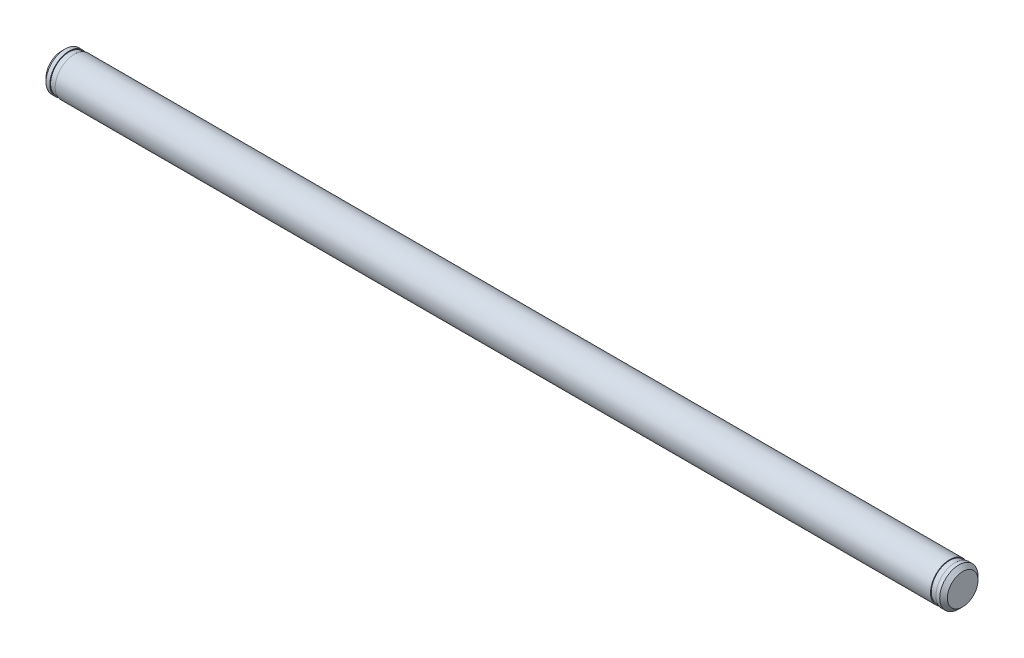
ISO-10303-21;
HEADER;
FILE_DESCRIPTION(('STEP AP214'),'2;1');
FILE_NAME('part.step','',(''),(''),'','','');
FILE_SCHEMA(('AUTOMOTIVE_DESIGN { 1 0 10303 214 1 1 1 1 }'));
ENDSEC;
DATA;
#1=APPLICATION_CONTEXT('core data for automotive mechanical design processes');
#2=APPLICATION_PROTOCOL_DEFINITION('international standard','automotive_design',2000,#1);
#3=PRODUCT_CONTEXT('',#1,'mechanical');
#4=PRODUCT('Part','Part','',(#3));
#5=PRODUCT_RELATED_PRODUCT_CATEGORY('part','',(#4));
#6=PRODUCT_DEFINITION_FORMATION('','',#4);
#7=PRODUCT_DEFINITION_CONTEXT('part definition',#1,'design');
#8=PRODUCT_DEFINITION('design','',#6,#7);
#9=PRODUCT_DEFINITION_SHAPE('','',#8);
#10=(LENGTH_UNIT() NAMED_UNIT(*) SI_UNIT(.MILLI.,.METRE.));
#11=(NAMED_UNIT(*) PLANE_ANGLE_UNIT() SI_UNIT($,.RADIAN.));
#12=(NAMED_UNIT(*) SI_UNIT($,.STERADIAN.) SOLID_ANGLE_UNIT());
#13=UNCERTAINTY_MEASURE_WITH_UNIT(LENGTH_MEASURE(1.E-05),#10,'distance_accuracy_value','');
#14=(GEOMETRIC_REPRESENTATION_CONTEXT(3) GLOBAL_UNCERTAINTY_ASSIGNED_CONTEXT((#13)) GLOBAL_UNIT_ASSIGNED_CONTEXT((#10,
#11,#12)) REPRESENTATION_CONTEXT('',''));
#15=CARTESIAN_POINT('',(0.,0.,0.));
#16=DIRECTION('',(0.,0.,1.));
#17=DIRECTION('',(1.,0.,0.));
#18=AXIS2_PLACEMENT_3D('',#15,#16,#17);
#19=CARTESIAN_POINT('',(-58.85,0.,0.));
#20=DIRECTION('',(-1.,0.,0.));
#21=DIRECTION('',(0.,-1.,0.));
#22=AXIS2_PLACEMENT_3D('',#19,#20,#21);
#23=PLANE('',#22);
#24=CARTESIAN_POINT('',(-58.85,0.,0.));
#25=DIRECTION('',(-1.,0.,0.));
#26=DIRECTION('',(0.,-1.,0.));
#27=AXIS2_PLACEMENT_3D('',#24,#25,#26);
#28=CIRCLE('',#27,2.);
#29=CARTESIAN_POINT('',(-58.85,-2.00000000000001,0.));
#30=VERTEX_POINT('',#29);
#31=EDGE_CURVE('E10',#30,#30,#28,.T.);
#32=ORIENTED_EDGE('',*,*,#31,.T.);
#33=EDGE_LOOP('',(#32));
#34=FACE_BOUND('',#33,.T.);
#35=ADVANCED_FACE('F34',(#34),#23,.T.);
#36=CARTESIAN_POINT('',(58.85,0.,0.));
#37=DIRECTION('',(1.,0.,0.));
#38=DIRECTION('',(0.,1.,0.));
#39=AXIS2_PLACEMENT_3D('',#36,#37,#38);
#40=CYLINDRICAL_SURFACE('',#39,2.5);
#41=CARTESIAN_POINT('',(-58.35,0.,0.));
#42=DIRECTION('',(-1.,0.,0.));
#43=DIRECTION('',(0.,-1.,0.));
#44=AXIS2_PLACEMENT_3D('',#41,#42,#43);
#45=CIRCLE('',#44,2.5);
#46=CARTESIAN_POINT('',(-58.35,-2.50000000000001,0.));
#47=VERTEX_POINT('',#46);
#48=EDGE_CURVE('E42',#47,#47,#45,.F.);
#49=ORIENTED_EDGE('',*,*,#48,.T.);
#50=EDGE_LOOP('',(#49));
#51=FACE_BOUND('',#50,.T.);
#52=CARTESIAN_POINT('',(-57.85,0.,0.));
#53=DIRECTION('',(1.,0.,0.));
#54=DIRECTION('',(0.,1.,0.));
#55=AXIS2_PLACEMENT_3D('',#52,#53,#54);
#56=CIRCLE('',#55,2.5);
#57=CARTESIAN_POINT('',(-57.85,2.49999999999999,0.));
#58=VERTEX_POINT('',#57);
#59=EDGE_CURVE('E55',#58,#58,#56,.T.);
#60=ORIENTED_EDGE('',*,*,#59,.F.);
#61=EDGE_LOOP('',(#60));
#62=FACE_BOUND('',#61,.T.);
#63=ADVANCED_FACE('F98',(#51,#62),#40,.T.);
#64=CARTESIAN_POINT('',(-57.85,2.49999999999999,0.));
#65=DIRECTION('',(1.,0.,0.));
#66=DIRECTION('',(0.,1.,0.));
#67=AXIS2_PLACEMENT_3D('',#64,#65,#66);
#68=PLANE('',#67);
#69=ORIENTED_EDGE('',*,*,#59,.T.);
#70=EDGE_LOOP('',(#69));
#71=FACE_BOUND('',#70,.T.);
#72=CARTESIAN_POINT('',(-57.85,0.,0.));
#73=DIRECTION('',(1.,0.,0.));
#74=DIRECTION('',(0.,1.,0.));
#75=AXIS2_PLACEMENT_3D('',#72,#73,#74);
#76=CIRCLE('',#75,2.4);
#77=CARTESIAN_POINT('',(-57.85,2.39999999999999,0.));
#78=VERTEX_POINT('',#77);
#79=EDGE_CURVE('E58',#78,#78,#76,.T.);
#80=ORIENTED_EDGE('',*,*,#79,.F.);
#81=EDGE_LOOP('',(#80));
#82=FACE_BOUND('',#81,.T.);
#83=ADVANCED_FACE('F103',(#71,#82),#68,.T.);
#84=CARTESIAN_POINT('',(58.85,0.,0.));
#85=DIRECTION('',(1.,0.,0.));
#86=DIRECTION('',(0.,1.,0.));
#87=AXIS2_PLACEMENT_3D('',#84,#85,#86);
#88=CYLINDRICAL_SURFACE('',#87,2.4);
#89=ORIENTED_EDGE('',*,*,#79,.T.);
#90=EDGE_LOOP('',(#89));
#91=FACE_BOUND('',#90,.T.);
#92=CARTESIAN_POINT('',(-57.15,0.,0.));
#93=DIRECTION('',(1.,0.,0.));
#94=DIRECTION('',(0.,1.,0.));
#95=AXIS2_PLACEMENT_3D('',#92,#93,#94);
#96=CIRCLE('',#95,2.4);
#97=CARTESIAN_POINT('',(-57.15,2.39999999999999,0.));
#98=VERTEX_POINT('',#97);
#99=EDGE_CURVE('E61',#98,#98,#96,.T.);
#100=ORIENTED_EDGE('',*,*,#99,.F.);
#101=EDGE_LOOP('',(#100));
#102=FACE_BOUND('',#101,.T.);
#103=ADVANCED_FACE('F179',(#91,#102),#88,.T.);
#104=CARTESIAN_POINT('',(-57.15,2.39999999999999,0.));
#105=DIRECTION('',(-1.,0.,0.));
#106=DIRECTION('',(0.,-1.,0.));
#107=AXIS2_PLACEMENT_3D('',#104,#105,#106);
#108=PLANE('',#107);
#109=ORIENTED_EDGE('',*,*,#99,.T.);
#110=EDGE_LOOP('',(#109));
#111=FACE_BOUND('',#110,.T.);
#112=CARTESIAN_POINT('',(-57.15,0.,0.));
#113=DIRECTION('',(1.,0.,0.));
#114=DIRECTION('',(0.,1.,0.));
#115=AXIS2_PLACEMENT_3D('',#112,#113,#114);
#116=CIRCLE('',#115,2.5);
#117=CARTESIAN_POINT('',(-57.15,2.49999999999999,0.));
#118=VERTEX_POINT('',#117);
#119=EDGE_CURVE('E64',#118,#118,#116,.T.);
#120=ORIENTED_EDGE('',*,*,#119,.F.);
#121=EDGE_LOOP('',(#120));
#122=FACE_BOUND('',#121,.T.);
#123=ADVANCED_FACE('F169',(#111,#122),#108,.T.);
#124=CARTESIAN_POINT('',(58.85,0.,0.));
#125=DIRECTION('',(1.,0.,0.));
#126=DIRECTION('',(0.,1.,0.));
#127=AXIS2_PLACEMENT_3D('',#124,#125,#126);
#128=CYLINDRICAL_SURFACE('',#127,2.5);
#129=ORIENTED_EDGE('',*,*,#119,.T.);
#130=EDGE_LOOP('',(#129));
#131=FACE_BOUND('',#130,.T.);
#132=CARTESIAN_POINT('',(57.15,0.,0.));
#133=DIRECTION('',(1.,0.,0.));
#134=DIRECTION('',(0.,1.,0.));
#135=AXIS2_PLACEMENT_3D('',#132,#133,#134);
#136=CIRCLE('',#135,2.5);
#137=CARTESIAN_POINT('',(57.15,2.5,0.));
#138=VERTEX_POINT('',#137);
#139=EDGE_CURVE('E67',#138,#138,#136,.T.);
#140=ORIENTED_EDGE('',*,*,#139,.F.);
#141=EDGE_LOOP('',(#140));
#142=FACE_BOUND('',#141,.T.);
#143=ADVANCED_FACE('F159',(#131,#142),#128,.T.);
#144=CARTESIAN_POINT('',(57.15,2.4,0.));
#145=DIRECTION('',(1.,0.,0.));
#146=DIRECTION('',(0.,1.,0.));
#147=AXIS2_PLACEMENT_3D('',#144,#145,#146);
#148=PLANE('',#147);
#149=ORIENTED_EDGE('',*,*,#139,.T.);
#150=EDGE_LOOP('',(#149));
#151=FACE_BOUND('',#150,.T.);
#152=CARTESIAN_POINT('',(57.15,0.,0.));
#153=DIRECTION('',(1.,0.,0.));
#154=DIRECTION('',(0.,1.,0.));
#155=AXIS2_PLACEMENT_3D('',#152,#153,#154);
#156=CIRCLE('',#155,2.4);
#157=CARTESIAN_POINT('',(57.15,2.4,0.));
#158=VERTEX_POINT('',#157);
#159=EDGE_CURVE('E70',#158,#158,#156,.T.);
#160=ORIENTED_EDGE('',*,*,#159,.F.);
#161=EDGE_LOOP('',(#160));
#162=FACE_BOUND('',#161,.T.);
#163=ADVANCED_FACE('F94',(#151,#162),#148,.T.);
#164=CARTESIAN_POINT('',(58.85,0.,0.));
#165=DIRECTION('',(1.,0.,0.));
#166=DIRECTION('',(0.,1.,0.));
#167=AXIS2_PLACEMENT_3D('',#164,#165,#166);
#168=CYLINDRICAL_SURFACE('',#167,2.4);
#169=ORIENTED_EDGE('',*,*,#159,.T.);
#170=EDGE_LOOP('',(#169));
#171=FACE_BOUND('',#170,.T.);
#172=CARTESIAN_POINT('',(57.85,0.,0.));
#173=DIRECTION('',(1.,0.,0.));
#174=DIRECTION('',(0.,1.,0.));
#175=AXIS2_PLACEMENT_3D('',#172,#173,#174);
#176=CIRCLE('',#175,2.4);
#177=CARTESIAN_POINT('',(57.85,2.4,0.));
#178=VERTEX_POINT('',#177);
#179=EDGE_CURVE('E73',#178,#178,#176,.T.);
#180=ORIENTED_EDGE('',*,*,#179,.F.);
#181=EDGE_LOOP('',(#180));
#182=FACE_BOUND('',#181,.T.);
#183=ADVANCED_FACE('F84',(#171,#182),#168,.T.);
#184=CARTESIAN_POINT('',(57.85,2.5,0.));
#185=DIRECTION('',(-1.,0.,0.));
#186=DIRECTION('',(0.,-1.,0.));
#187=AXIS2_PLACEMENT_3D('',#184,#185,#186);
#188=PLANE('',#187);
#189=ORIENTED_EDGE('',*,*,#179,.T.);
#190=EDGE_LOOP('',(#189));
#191=FACE_BOUND('',#190,.T.);
#192=CARTESIAN_POINT('',(57.85,0.,0.));
#193=DIRECTION('',(1.,0.,0.));
#194=DIRECTION('',(0.,1.,0.));
#195=AXIS2_PLACEMENT_3D('',#192,#193,#194);
#196=CIRCLE('',#195,2.5);
#197=CARTESIAN_POINT('',(57.85,2.5,0.));
#198=VERTEX_POINT('',#197);
#199=EDGE_CURVE('E76',#198,#198,#196,.T.);
#200=ORIENTED_EDGE('',*,*,#199,.F.);
#201=EDGE_LOOP('',(#200));
#202=FACE_BOUND('',#201,.T.);
#203=ADVANCED_FACE('F82',(#191,#202),#188,.T.);
#204=CARTESIAN_POINT('',(58.85,0.,0.));
#205=DIRECTION('',(1.,0.,0.));
#206=DIRECTION('',(0.,1.,0.));
#207=AXIS2_PLACEMENT_3D('',#204,#205,#206);
#208=CYLINDRICAL_SURFACE('',#207,2.5);
#209=CARTESIAN_POINT('',(58.35,0.,0.));
#210=DIRECTION('',(1.,0.,0.));
#211=DIRECTION('',(0.,1.,0.));
#212=AXIS2_PLACEMENT_3D('',#209,#210,#211);
#213=CIRCLE('',#212,2.5);
#214=CARTESIAN_POINT('',(58.35,2.5,0.));
#215=VERTEX_POINT('',#214);
#216=EDGE_CURVE('E46',#215,#215,#213,.F.);
#217=ORIENTED_EDGE('',*,*,#216,.T.);
#218=EDGE_LOOP('',(#217));
#219=FACE_BOUND('',#218,.T.);
#220=ORIENTED_EDGE('',*,*,#199,.T.);
#221=EDGE_LOOP('',(#220));
#222=FACE_BOUND('',#221,.T.);
#223=ADVANCED_FACE('F80',(#219,#222),#208,.T.);
#224=CARTESIAN_POINT('',(58.85,0.,0.));
#225=DIRECTION('',(1.,0.,0.));
#226=DIRECTION('',(0.,1.,0.));
#227=AXIS2_PLACEMENT_3D('',#224,#225,#226);
#228=PLANE('',#227);
#229=CARTESIAN_POINT('',(58.85,0.,0.));
#230=DIRECTION('',(1.,0.,0.));
#231=DIRECTION('',(0.,1.,0.));
#232=AXIS2_PLACEMENT_3D('',#229,#230,#231);
#233=CIRCLE('',#232,2.00000000000003);
#234=CARTESIAN_POINT('',(58.85,2.00000000000004,0.));
#235=VERTEX_POINT('',#234);
#236=EDGE_CURVE('E50',#235,#235,#233,.T.);
#237=ORIENTED_EDGE('',*,*,#236,.T.);
#238=EDGE_LOOP('',(#237));
#239=FACE_BOUND('',#238,.T.);
#240=ADVANCED_FACE('F91',(#239),#228,.T.);
#241=CARTESIAN_POINT('',(58.85,0.,0.));
#242=DIRECTION('',(-1.,0.,0.));
#243=DIRECTION('',(0.,-1.,0.));
#244=AXIS2_PLACEMENT_3D('',#241,#242,#243);
#245=CONICAL_SURFACE('',#244,2.00000000000003,0.785398163397438);
#246=ORIENTED_EDGE('',*,*,#216,.F.);
#247=EDGE_LOOP('',(#246));
#248=FACE_BOUND('',#247,.T.);
#249=ORIENTED_EDGE('',*,*,#236,.F.);
#250=EDGE_LOOP('',(#249));
#251=FACE_BOUND('',#250,.T.);
#252=ADVANCED_FACE('F107',(#248,#251),#245,.T.);
#253=CARTESIAN_POINT('',(-58.35,0.,0.));
#254=DIRECTION('',(1.,0.,0.));
#255=DIRECTION('',(0.,1.,0.));
#256=AXIS2_PLACEMENT_3D('',#253,#254,#255);
#257=CONICAL_SURFACE('',#256,2.5,0.785398163397417);
#258=ORIENTED_EDGE('',*,*,#31,.F.);
#259=EDGE_LOOP('',(#258));
#260=FACE_BOUND('',#259,.T.);
#261=ORIENTED_EDGE('',*,*,#48,.F.);
#262=EDGE_LOOP('',(#261));
#263=FACE_BOUND('',#262,.T.);
#264=ADVANCED_FACE('F37',(#260,#263),#257,.T.);
#265=CLOSED_SHELL('',(#35,#63,#83,#103,#123,#143,#163,#183,#203,#223,#240,#252,#264));
#266=MANIFOLD_SOLID_BREP('B2',#265);
#267=ADVANCED_BREP_SHAPE_REPRESENTATION('',(#18,#266),#14);
#268=SHAPE_DEFINITION_REPRESENTATION(#9,#267);
ENDSEC;
END-ISO-10303-21;
